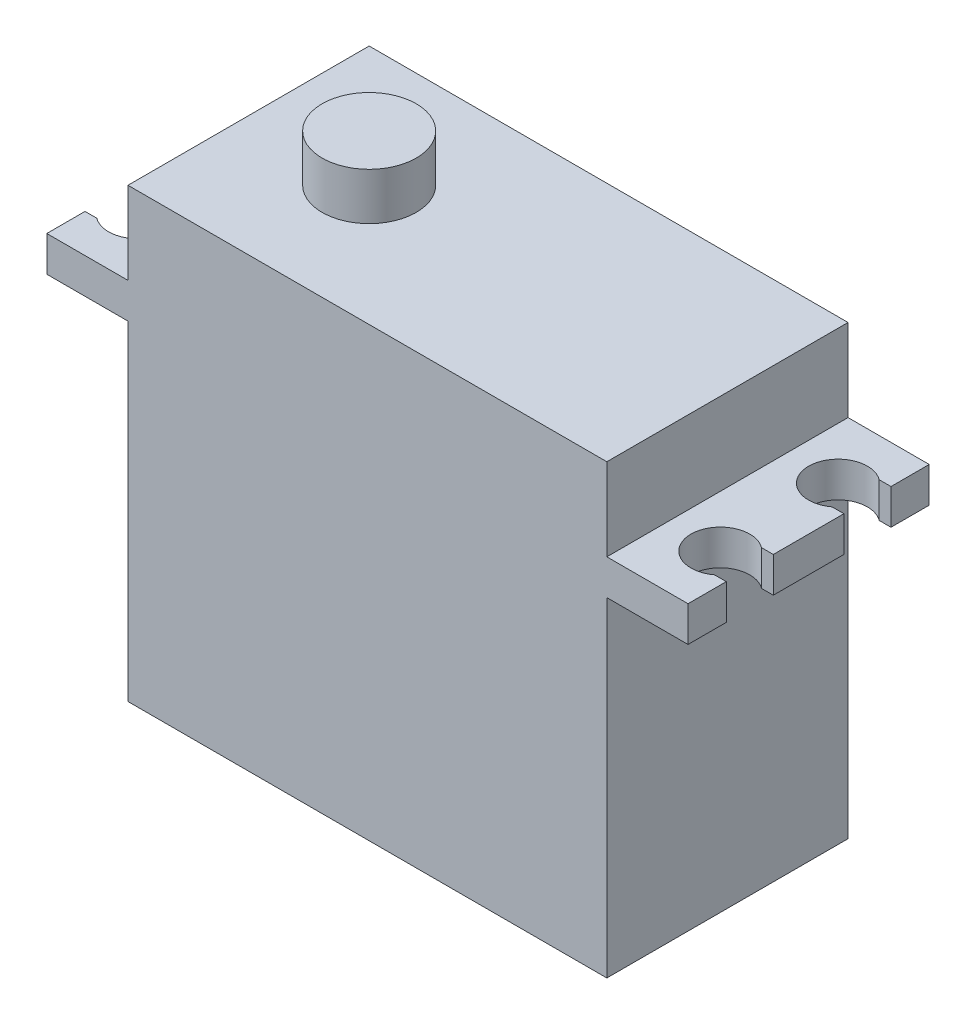
ISO-10303-21;
HEADER;
FILE_DESCRIPTION(('STEP AP214'),'2;1');
FILE_NAME('part.step','',(''),(''),'','','');
FILE_SCHEMA(('AUTOMOTIVE_DESIGN { 1 0 10303 214 1 1 1 1 }'));
ENDSEC;
DATA;
#1=APPLICATION_CONTEXT('core data for automotive mechanical design processes');
#2=APPLICATION_PROTOCOL_DEFINITION('international standard','automotive_design',2000,#1);
#3=PRODUCT_CONTEXT('',#1,'mechanical');
#4=PRODUCT('Part','Part','',(#3));
#5=PRODUCT_RELATED_PRODUCT_CATEGORY('part','',(#4));
#6=PRODUCT_DEFINITION_FORMATION('','',#4);
#7=PRODUCT_DEFINITION_CONTEXT('part definition',#1,'design');
#8=PRODUCT_DEFINITION('design','',#6,#7);
#9=PRODUCT_DEFINITION_SHAPE('','',#8);
#10=(LENGTH_UNIT() NAMED_UNIT(*) SI_UNIT(.MILLI.,.METRE.));
#11=(NAMED_UNIT(*) PLANE_ANGLE_UNIT() SI_UNIT($,.RADIAN.));
#12=(NAMED_UNIT(*) SI_UNIT($,.STERADIAN.) SOLID_ANGLE_UNIT());
#13=UNCERTAINTY_MEASURE_WITH_UNIT(LENGTH_MEASURE(1.E-05),#10,'distance_accuracy_value','');
#14=(GEOMETRIC_REPRESENTATION_CONTEXT(3) GLOBAL_UNCERTAINTY_ASSIGNED_CONTEXT((#13)) GLOBAL_UNIT_ASSIGNED_CONTEXT((#10,
#11,#12)) REPRESENTATION_CONTEXT('',''));
#15=CARTESIAN_POINT('',(0.,0.,0.));
#16=DIRECTION('',(0.,0.,1.));
#17=DIRECTION('',(1.,0.,0.));
#18=AXIS2_PLACEMENT_3D('',#15,#16,#17);
#19=CARTESIAN_POINT('',(47.6,31.,-20.5));
#20=DIRECTION('',(-1.,0.,0.));
#21=DIRECTION('',(0.,0.,1.));
#22=AXIS2_PLACEMENT_3D('',#19,#20,#21);
#23=PLANE('',#22);
#24=DIRECTION('',(0.,0.,-1.));
#25=VECTOR('',#24,1.);
#26=CARTESIAN_POINT('',(47.6,28.,-20.5));
#27=LINE('',#26,#25);
#28=CARTESIAN_POINT('',(47.6,28.,-7.25000000000004));
#29=VERTEX_POINT('',#28);
#30=CARTESIAN_POINT('',(47.6,28.,-13.25));
#31=VERTEX_POINT('',#30);
#32=EDGE_CURVE('E237',#29,#31,#27,.T.);
#33=ORIENTED_EDGE('',*,*,#32,.T.);
#34=DIRECTION('',(0.,-1.,0.));
#35=VECTOR('',#34,1.);
#36=CARTESIAN_POINT('',(47.6,42.,-13.25));
#37=LINE('',#36,#35);
#38=CARTESIAN_POINT('',(47.6,31.,-13.25));
#39=VERTEX_POINT('',#38);
#40=EDGE_CURVE('E221',#39,#31,#37,.T.);
#41=ORIENTED_EDGE('',*,*,#40,.F.);
#42=DIRECTION('',(0.,0.,-1.));
#43=VECTOR('',#42,1.);
#44=CARTESIAN_POINT('',(47.6,31.,-20.5));
#45=LINE('',#44,#43);
#46=CARTESIAN_POINT('',(47.6,31.,-7.25000000000004));
#47=VERTEX_POINT('',#46);
#48=EDGE_CURVE('E369',#47,#39,#45,.T.);
#49=ORIENTED_EDGE('',*,*,#48,.F.);
#50=DIRECTION('',(0.,-1.,0.));
#51=VECTOR('',#50,1.);
#52=CARTESIAN_POINT('',(47.6,42.,-7.25000000000004));
#53=LINE('',#52,#51);
#54=EDGE_CURVE('E244',#47,#29,#53,.T.);
#55=ORIENTED_EDGE('',*,*,#54,.T.);
#56=EDGE_LOOP('',(#33,#41,#49,#55));
#57=FACE_BOUND('',#56,.T.);
#58=ADVANCED_FACE('F36',(#57),#23,.F.);
#59=CARTESIAN_POINT('',(47.6,31.,-17.25));
#60=VERTEX_POINT('',#59);
#61=CARTESIAN_POINT('',(47.6,31.,-20.5));
#62=VERTEX_POINT('',#61);
#63=EDGE_CURVE('E366',#60,#62,#45,.T.);
#64=ORIENTED_EDGE('',*,*,#63,.F.);
#65=DIRECTION('',(0.,-1.,0.));
#66=VECTOR('',#65,1.);
#67=CARTESIAN_POINT('',(47.6,42.,-17.25));
#68=LINE('',#67,#66);
#69=CARTESIAN_POINT('',(47.6,28.,-17.25));
#70=VERTEX_POINT('',#69);
#71=EDGE_CURVE('E230',#60,#70,#68,.T.);
#72=ORIENTED_EDGE('',*,*,#71,.T.);
#73=CARTESIAN_POINT('',(47.6,28.,-20.5));
#74=VERTEX_POINT('',#73);
#75=EDGE_CURVE('E246',#70,#74,#27,.T.);
#76=ORIENTED_EDGE('',*,*,#75,.T.);
#77=DIRECTION('',(0.,-1.,0.));
#78=VECTOR('',#77,1.);
#79=CARTESIAN_POINT('',(47.6,31.,-20.5));
#80=LINE('',#79,#78);
#81=EDGE_CURVE('E261',#62,#74,#80,.T.);
#82=ORIENTED_EDGE('',*,*,#81,.F.);
#83=EDGE_LOOP('',(#64,#72,#76,#82));
#84=FACE_BOUND('',#83,.T.);
#85=ADVANCED_FACE('F461',(#84),#23,.F.);
#86=DIRECTION('',(0.,-1.,0.));
#87=VECTOR('',#86,1.);
#88=CARTESIAN_POINT('',(47.6,42.,-3.25000000000004));
#89=LINE('',#88,#87);
#90=CARTESIAN_POINT('',(47.6,31.,-3.25000000000004));
#91=VERTEX_POINT('',#90);
#92=CARTESIAN_POINT('',(47.6,28.,-3.25000000000004));
#93=VERTEX_POINT('',#92);
#94=EDGE_CURVE('E59',#91,#93,#89,.T.);
#95=ORIENTED_EDGE('',*,*,#94,.F.);
#96=CARTESIAN_POINT('',(47.6,31.,0.));
#97=VERTEX_POINT('',#96);
#98=EDGE_CURVE('E371',#97,#91,#45,.T.);
#99=ORIENTED_EDGE('',*,*,#98,.F.);
#100=DIRECTION('',(0.,-1.,0.));
#101=VECTOR('',#100,1.);
#102=CARTESIAN_POINT('',(47.6,31.,0.));
#103=LINE('',#102,#101);
#104=CARTESIAN_POINT('',(47.6,28.,0.));
#105=VERTEX_POINT('',#104);
#106=EDGE_CURVE('E265',#97,#105,#103,.T.);
#107=ORIENTED_EDGE('',*,*,#106,.T.);
#108=EDGE_CURVE('E245',#105,#93,#27,.T.);
#109=ORIENTED_EDGE('',*,*,#108,.T.);
#110=EDGE_LOOP('',(#95,#99,#107,#109));
#111=FACE_BOUND('',#110,.T.);
#112=ADVANCED_FACE('F463',(#111),#23,.F.);
#113=CARTESIAN_POINT('',(0.,31.,0.));
#114=DIRECTION('',(0.,1.,0.));
#115=DIRECTION('',(0.,0.,1.));
#116=AXIS2_PLACEMENT_3D('',#113,#114,#115);
#117=PLANE('',#116);
#118=DIRECTION('',(1.,0.,0.));
#119=VECTOR('',#118,1.);
#120=CARTESIAN_POINT('',(0.,31.,-13.25));
#121=LINE('',#120,#119);
#122=CARTESIAN_POINT('',(46.6,31.,-13.25));
#123=VERTEX_POINT('',#122);
#124=EDGE_CURVE('E224',#123,#39,#121,.T.);
#125=ORIENTED_EDGE('',*,*,#124,.F.);
#126=CARTESIAN_POINT('',(45.1,31.,-15.25));
#127=DIRECTION('',(0.,1.,0.));
#128=DIRECTION('',(0.,0.,1.));
#129=AXIS2_PLACEMENT_3D('',#126,#127,#128);
#130=CIRCLE('',#129,2.5);
#131=CARTESIAN_POINT('',(46.6,31.,-17.25));
#132=VERTEX_POINT('',#131);
#133=EDGE_CURVE('E229',#132,#123,#130,.T.);
#134=ORIENTED_EDGE('',*,*,#133,.F.);
#135=DIRECTION('',(-1.,0.,0.));
#136=VECTOR('',#135,1.);
#137=CARTESIAN_POINT('',(0.,31.,-17.25));
#138=LINE('',#137,#136);
#139=EDGE_CURVE('E519',#60,#132,#138,.T.);
#140=ORIENTED_EDGE('',*,*,#139,.F.);
#141=ORIENTED_EDGE('',*,*,#63,.T.);
#142=DIRECTION('',(-1.,0.,0.));
#143=VECTOR('',#142,1.);
#144=CARTESIAN_POINT('',(-6.90000000000001,31.,-20.5));
#145=LINE('',#144,#143);
#146=CARTESIAN_POINT('',(40.7,31.,-20.5));
#147=VERTEX_POINT('',#146);
#148=EDGE_CURVE('E262',#62,#147,#145,.T.);
#149=ORIENTED_EDGE('',*,*,#148,.T.);
#150=DIRECTION('',(0.,0.,-1.));
#151=VECTOR('',#150,1.);
#152=CARTESIAN_POINT('',(40.7,31.,0.));
#153=LINE('',#152,#151);
#154=CARTESIAN_POINT('',(40.7,31.,0.));
#155=VERTEX_POINT('',#154);
#156=EDGE_CURVE('E277',#155,#147,#153,.T.);
#157=ORIENTED_EDGE('',*,*,#156,.F.);
#158=DIRECTION('',(1.,0.,0.));
#159=VECTOR('',#158,1.);
#160=CARTESIAN_POINT('',(-6.9,31.,0.));
#161=LINE('',#160,#159);
#162=EDGE_CURVE('E367',#155,#97,#161,.T.);
#163=ORIENTED_EDGE('',*,*,#162,.T.);
#164=ORIENTED_EDGE('',*,*,#98,.T.);
#165=DIRECTION('',(-1.,0.,0.));
#166=VECTOR('',#165,1.);
#167=CARTESIAN_POINT('',(0.,31.,-3.24999999999997));
#168=LINE('',#167,#166);
#169=CARTESIAN_POINT('',(46.6,31.,-3.25000000000003));
#170=VERTEX_POINT('',#169);
#171=EDGE_CURVE('E483',#91,#170,#168,.T.);
#172=ORIENTED_EDGE('',*,*,#171,.T.);
#173=CARTESIAN_POINT('',(45.1,31.,-5.25000000000003));
#174=DIRECTION('',(0.,1.,0.));
#175=DIRECTION('',(0.,0.,1.));
#176=AXIS2_PLACEMENT_3D('',#173,#174,#175);
#177=CIRCLE('',#176,2.5);
#178=CARTESIAN_POINT('',(46.6,31.,-7.25000000000004));
#179=VERTEX_POINT('',#178);
#180=EDGE_CURVE('E443',#170,#179,#177,.F.);
#181=ORIENTED_EDGE('',*,*,#180,.T.);
#182=DIRECTION('',(1.,0.,0.));
#183=VECTOR('',#182,1.);
#184=CARTESIAN_POINT('',(0.,31.,-7.24999999999997));
#185=LINE('',#184,#183);
#186=EDGE_CURVE('E439',#179,#47,#185,.T.);
#187=ORIENTED_EDGE('',*,*,#186,.T.);
#188=ORIENTED_EDGE('',*,*,#48,.T.);
#189=EDGE_LOOP('',(#125,#134,#140,#141,#149,#157,#163,#164,#172,#181,#187,#188));
#190=FACE_BOUND('',#189,.T.);
#191=ADVANCED_FACE('F471',(#190),#117,.T.);
#192=CARTESIAN_POINT('',(0.,28.,0.));
#193=DIRECTION('',(0.,1.,0.));
#194=DIRECTION('',(0.,0.,1.));
#195=AXIS2_PLACEMENT_3D('',#192,#193,#194);
#196=PLANE('',#195);
#197=CARTESIAN_POINT('',(45.1,28.,-15.25));
#198=DIRECTION('',(0.,-1.,0.));
#199=DIRECTION('',(0.,0.,1.));
#200=AXIS2_PLACEMENT_3D('',#197,#198,#199);
#201=CIRCLE('',#200,2.5);
#202=CARTESIAN_POINT('',(46.6,28.,-13.25));
#203=VERTEX_POINT('',#202);
#204=CARTESIAN_POINT('',(46.6,28.,-17.25));
#205=VERTEX_POINT('',#204);
#206=EDGE_CURVE('E240',#203,#205,#201,.T.);
#207=ORIENTED_EDGE('',*,*,#206,.F.);
#208=DIRECTION('',(-1.,0.,0.));
#209=VECTOR('',#208,1.);
#210=CARTESIAN_POINT('',(47.6,28.,-13.25));
#211=LINE('',#210,#209);
#212=EDGE_CURVE('E51',#31,#203,#211,.T.);
#213=ORIENTED_EDGE('',*,*,#212,.F.);
#214=ORIENTED_EDGE('',*,*,#32,.F.);
#215=DIRECTION('',(-1.,0.,0.));
#216=VECTOR('',#215,1.);
#217=CARTESIAN_POINT('',(47.6,28.,-7.25000000000004));
#218=LINE('',#217,#216);
#219=CARTESIAN_POINT('',(46.6,28.,-7.25000000000004));
#220=VERTEX_POINT('',#219);
#221=EDGE_CURVE('E493',#29,#220,#218,.T.);
#222=ORIENTED_EDGE('',*,*,#221,.T.);
#223=CARTESIAN_POINT('',(45.1,28.,-5.25000000000003));
#224=DIRECTION('',(0.,1.,0.));
#225=DIRECTION('',(0.,0.,-1.));
#226=AXIS2_PLACEMENT_3D('',#223,#224,#225);
#227=CIRCLE('',#226,2.5);
#228=CARTESIAN_POINT('',(46.6,28.,-3.25000000000003));
#229=VERTEX_POINT('',#228);
#230=EDGE_CURVE('E489',#220,#229,#227,.T.);
#231=ORIENTED_EDGE('',*,*,#230,.T.);
#232=DIRECTION('',(1.,0.,0.));
#233=VECTOR('',#232,1.);
#234=CARTESIAN_POINT('',(46.6,28.,-3.25000000000003));
#235=LINE('',#234,#233);
#236=EDGE_CURVE('E487',#229,#93,#235,.T.);
#237=ORIENTED_EDGE('',*,*,#236,.T.);
#238=ORIENTED_EDGE('',*,*,#108,.F.);
#239=DIRECTION('',(1.,0.,0.));
#240=VECTOR('',#239,1.);
#241=CARTESIAN_POINT('',(-6.9,28.,0.));
#242=LINE('',#241,#240);
#243=CARTESIAN_POINT('',(40.7,28.,0.));
#244=VERTEX_POINT('',#243);
#245=EDGE_CURVE('E350',#244,#105,#242,.T.);
#246=ORIENTED_EDGE('',*,*,#245,.F.);
#247=DIRECTION('',(0.,0.,-1.));
#248=VECTOR('',#247,1.);
#249=CARTESIAN_POINT('',(40.7,28.,0.));
#250=LINE('',#249,#248);
#251=CARTESIAN_POINT('',(40.7,28.,-20.5));
#252=VERTEX_POINT('',#251);
#253=EDGE_CURVE('E271',#244,#252,#250,.T.);
#254=ORIENTED_EDGE('',*,*,#253,.T.);
#255=DIRECTION('',(-1.,0.,0.));
#256=VECTOR('',#255,1.);
#257=CARTESIAN_POINT('',(-6.90000000000001,28.,-20.5));
#258=LINE('',#257,#256);
#259=EDGE_CURVE('E254',#74,#252,#258,.T.);
#260=ORIENTED_EDGE('',*,*,#259,.F.);
#261=ORIENTED_EDGE('',*,*,#75,.F.);
#262=DIRECTION('',(1.,0.,0.));
#263=VECTOR('',#262,1.);
#264=CARTESIAN_POINT('',(46.6,28.,-17.25));
#265=LINE('',#264,#263);
#266=EDGE_CURVE('E241',#205,#70,#265,.T.);
#267=ORIENTED_EDGE('',*,*,#266,.F.);
#268=EDGE_LOOP('',(#207,#213,#214,#222,#231,#237,#238,#246,#254,#260,#261,#267));
#269=FACE_BOUND('',#268,.T.);
#270=ADVANCED_FACE('F235',(#269),#196,.F.);
#271=CARTESIAN_POINT('',(-6.90000000000001,31.,-20.5));
#272=DIRECTION('',(1.,0.,0.));
#273=DIRECTION('',(0.,0.,-1.));
#274=AXIS2_PLACEMENT_3D('',#271,#272,#273);
#275=PLANE('',#274);
#276=DIRECTION('',(0.,0.,1.));
#277=VECTOR('',#276,1.);
#278=CARTESIAN_POINT('',(-6.90000000000001,28.,-20.5));
#279=LINE('',#278,#277);
#280=CARTESIAN_POINT('',(-6.90000000000001,28.,-13.25));
#281=VERTEX_POINT('',#280);
#282=CARTESIAN_POINT('',(-6.90000000000001,28.,-7.25));
#283=VERTEX_POINT('',#282);
#284=EDGE_CURVE('E341',#281,#283,#279,.T.);
#285=ORIENTED_EDGE('',*,*,#284,.T.);
#286=DIRECTION('',(0.,1.,0.));
#287=VECTOR('',#286,1.);
#288=CARTESIAN_POINT('',(-6.90000000000001,31.,-7.25));
#289=LINE('',#288,#287);
#290=CARTESIAN_POINT('',(-6.90000000000001,31.,-7.25));
#291=VERTEX_POINT('',#290);
#292=EDGE_CURVE('E12',#283,#291,#289,.T.);
#293=ORIENTED_EDGE('',*,*,#292,.T.);
#294=DIRECTION('',(0.,0.,1.));
#295=VECTOR('',#294,1.);
#296=CARTESIAN_POINT('',(-6.90000000000001,31.,-20.5));
#297=LINE('',#296,#295);
#298=CARTESIAN_POINT('',(-6.90000000000001,31.,-13.25));
#299=VERTEX_POINT('',#298);
#300=EDGE_CURVE('E393',#299,#291,#297,.T.);
#301=ORIENTED_EDGE('',*,*,#300,.F.);
#302=DIRECTION('',(0.,1.,0.));
#303=VECTOR('',#302,1.);
#304=CARTESIAN_POINT('',(-6.90000000000001,31.,-13.25));
#305=LINE('',#304,#303);
#306=EDGE_CURVE('E324',#281,#299,#305,.T.);
#307=ORIENTED_EDGE('',*,*,#306,.F.);
#308=EDGE_LOOP('',(#285,#293,#301,#307));
#309=FACE_BOUND('',#308,.T.);
#310=ADVANCED_FACE('F429',(#309),#275,.F.);
#311=DIRECTION('',(-1.,0.,0.));
#312=VECTOR('',#311,1.);
#313=CARTESIAN_POINT('',(0.,31.,-7.25));
#314=LINE('',#313,#312);
#315=CARTESIAN_POINT('',(-5.90000000000002,31.,-7.25));
#316=VERTEX_POINT('',#315);
#317=EDGE_CURVE('E399',#316,#291,#314,.T.);
#318=ORIENTED_EDGE('',*,*,#317,.F.);
#319=CARTESIAN_POINT('',(-4.40000000000001,31.,-5.25));
#320=DIRECTION('',(0.,1.,0.));
#321=DIRECTION('',(0.,0.,1.));
#322=AXIS2_PLACEMENT_3D('',#319,#320,#321);
#323=CIRCLE('',#322,2.5);
#324=CARTESIAN_POINT('',(-5.90000000000001,31.,-3.25));
#325=VERTEX_POINT('',#324);
#326=EDGE_CURVE('E397',#325,#316,#323,.T.);
#327=ORIENTED_EDGE('',*,*,#326,.F.);
#328=DIRECTION('',(1.,0.,0.));
#329=VECTOR('',#328,1.);
#330=CARTESIAN_POINT('',(0.,31.,-3.25));
#331=LINE('',#330,#329);
#332=CARTESIAN_POINT('',(-6.90000000000001,31.,-3.25));
#333=VERTEX_POINT('',#332);
#334=EDGE_CURVE('E396',#333,#325,#331,.T.);
#335=ORIENTED_EDGE('',*,*,#334,.F.);
#336=CARTESIAN_POINT('',(-6.9,31.,0.));
#337=VERTEX_POINT('',#336);
#338=EDGE_CURVE('E257',#333,#337,#297,.T.);
#339=ORIENTED_EDGE('',*,*,#338,.T.);
#340=CARTESIAN_POINT('',(0.,31.,0.));
#341=VERTEX_POINT('',#340);
#342=EDGE_CURVE('E362',#337,#341,#161,.T.);
#343=ORIENTED_EDGE('',*,*,#342,.T.);
#344=DIRECTION('',(0.,0.,1.));
#345=VECTOR('',#344,1.);
#346=CARTESIAN_POINT('',(0.,31.,0.));
#347=LINE('',#346,#345);
#348=CARTESIAN_POINT('',(0.,31.,-20.5));
#349=VERTEX_POINT('',#348);
#350=EDGE_CURVE('E279',#349,#341,#347,.T.);
#351=ORIENTED_EDGE('',*,*,#350,.F.);
#352=CARTESIAN_POINT('',(-6.90000000000001,31.,-20.5));
#353=VERTEX_POINT('',#352);
#354=EDGE_CURVE('E375',#349,#353,#145,.T.);
#355=ORIENTED_EDGE('',*,*,#354,.T.);
#356=CARTESIAN_POINT('',(-6.90000000000001,31.,-17.25));
#357=VERTEX_POINT('',#356);
#358=EDGE_CURVE('E372',#353,#357,#297,.T.);
#359=ORIENTED_EDGE('',*,*,#358,.T.);
#360=DIRECTION('',(1.,0.,0.));
#361=VECTOR('',#360,1.);
#362=CARTESIAN_POINT('',(0.,31.,-17.25));
#363=LINE('',#362,#361);
#364=CARTESIAN_POINT('',(-5.90000000000001,31.,-17.25));
#365=VERTEX_POINT('',#364);
#366=EDGE_CURVE('E421',#357,#365,#363,.T.);
#367=ORIENTED_EDGE('',*,*,#366,.T.);
#368=CARTESIAN_POINT('',(-4.40000000000001,31.,-15.25));
#369=DIRECTION('',(0.,1.,0.));
#370=DIRECTION('',(0.,0.,1.));
#371=AXIS2_PLACEMENT_3D('',#368,#369,#370);
#372=CIRCLE('',#371,2.5);
#373=CARTESIAN_POINT('',(-5.90000000000002,31.,-13.25));
#374=VERTEX_POINT('',#373);
#375=EDGE_CURVE('E342',#365,#374,#372,.F.);
#376=ORIENTED_EDGE('',*,*,#375,.T.);
#377=DIRECTION('',(-1.,0.,0.));
#378=VECTOR('',#377,1.);
#379=CARTESIAN_POINT('',(0.,31.,-13.25));
#380=LINE('',#379,#378);
#381=EDGE_CURVE('E346',#374,#299,#380,.T.);
#382=ORIENTED_EDGE('',*,*,#381,.T.);
#383=ORIENTED_EDGE('',*,*,#300,.T.);
#384=EDGE_LOOP('',(#318,#327,#335,#339,#343,#351,#355,#359,#367,#376,#382,#383));
#385=FACE_BOUND('',#384,.T.);
#386=ADVANCED_FACE('F384',(#385),#117,.T.);
#387=CARTESIAN_POINT('',(-4.40000000000001,28.,-5.25));
#388=DIRECTION('',(0.,-1.,0.));
#389=DIRECTION('',(0.,0.,-1.));
#390=AXIS2_PLACEMENT_3D('',#387,#388,#389);
#391=CIRCLE('',#390,2.5);
#392=CARTESIAN_POINT('',(-5.90000000000002,28.,-7.25));
#393=VERTEX_POINT('',#392);
#394=CARTESIAN_POINT('',(-5.90000000000001,28.,-3.25));
#395=VERTEX_POINT('',#394);
#396=EDGE_CURVE('E438',#393,#395,#391,.T.);
#397=ORIENTED_EDGE('',*,*,#396,.F.);
#398=DIRECTION('',(1.,0.,0.));
#399=VECTOR('',#398,1.);
#400=CARTESIAN_POINT('',(-6.90000000000001,28.,-7.25));
#401=LINE('',#400,#399);
#402=EDGE_CURVE('E436',#283,#393,#401,.T.);
#403=ORIENTED_EDGE('',*,*,#402,.F.);
#404=ORIENTED_EDGE('',*,*,#284,.F.);
#405=DIRECTION('',(1.,0.,0.));
#406=VECTOR('',#405,1.);
#407=CARTESIAN_POINT('',(-6.90000000000001,28.,-13.25));
#408=LINE('',#407,#406);
#409=CARTESIAN_POINT('',(-5.90000000000002,28.,-13.25));
#410=VERTEX_POINT('',#409);
#411=EDGE_CURVE('E408',#281,#410,#408,.T.);
#412=ORIENTED_EDGE('',*,*,#411,.T.);
#413=CARTESIAN_POINT('',(-4.40000000000001,28.,-15.25));
#414=DIRECTION('',(0.,1.,0.));
#415=DIRECTION('',(0.,0.,1.));
#416=AXIS2_PLACEMENT_3D('',#413,#414,#415);
#417=CIRCLE('',#416,2.5);
#418=CARTESIAN_POINT('',(-5.90000000000001,28.,-17.25));
#419=VERTEX_POINT('',#418);
#420=EDGE_CURVE('E411',#410,#419,#417,.T.);
#421=ORIENTED_EDGE('',*,*,#420,.T.);
#422=DIRECTION('',(-1.,0.,0.));
#423=VECTOR('',#422,1.);
#424=CARTESIAN_POINT('',(-5.90000000000001,28.,-17.25));
#425=LINE('',#424,#423);
#426=CARTESIAN_POINT('',(-6.90000000000001,28.,-17.25));
#427=VERTEX_POINT('',#426);
#428=EDGE_CURVE('E414',#419,#427,#425,.T.);
#429=ORIENTED_EDGE('',*,*,#428,.T.);
#430=CARTESIAN_POINT('',(-6.90000000000001,28.,-20.5));
#431=VERTEX_POINT('',#430);
#432=EDGE_CURVE('E343',#431,#427,#279,.T.);
#433=ORIENTED_EDGE('',*,*,#432,.F.);
#434=CARTESIAN_POINT('',(0.,28.,-20.5));
#435=VERTEX_POINT('',#434);
#436=EDGE_CURVE('E249',#435,#431,#258,.T.);
#437=ORIENTED_EDGE('',*,*,#436,.F.);
#438=DIRECTION('',(0.,0.,1.));
#439=VECTOR('',#438,1.);
#440=CARTESIAN_POINT('',(0.,28.,0.));
#441=LINE('',#440,#439);
#442=CARTESIAN_POINT('',(0.,28.,0.));
#443=VERTEX_POINT('',#442);
#444=EDGE_CURVE('E274',#435,#443,#441,.T.);
#445=ORIENTED_EDGE('',*,*,#444,.T.);
#446=CARTESIAN_POINT('',(-6.9,28.,0.));
#447=VERTEX_POINT('',#446);
#448=EDGE_CURVE('E250',#447,#443,#242,.T.);
#449=ORIENTED_EDGE('',*,*,#448,.F.);
#450=CARTESIAN_POINT('',(-6.90000000000001,28.,-3.25));
#451=VERTEX_POINT('',#450);
#452=EDGE_CURVE('E331',#451,#447,#279,.T.);
#453=ORIENTED_EDGE('',*,*,#452,.F.);
#454=DIRECTION('',(-1.,0.,0.));
#455=VECTOR('',#454,1.);
#456=CARTESIAN_POINT('',(-5.90000000000001,28.,-3.25));
#457=LINE('',#456,#455);
#458=EDGE_CURVE('E339',#395,#451,#457,.T.);
#459=ORIENTED_EDGE('',*,*,#458,.F.);
#460=EDGE_LOOP('',(#397,#403,#404,#412,#421,#429,#433,#437,#445,#449,#453,#459));
#461=FACE_BOUND('',#460,.T.);
#462=ADVANCED_FACE('F338',(#461),#196,.F.);
#463=ORIENTED_EDGE('',*,*,#338,.F.);
#464=DIRECTION('',(0.,-1.,0.));
#465=VECTOR('',#464,1.);
#466=CARTESIAN_POINT('',(-6.90000000000001,31.,-3.25));
#467=LINE('',#466,#465);
#468=EDGE_CURVE('E44',#333,#451,#467,.T.);
#469=ORIENTED_EDGE('',*,*,#468,.T.);
#470=ORIENTED_EDGE('',*,*,#452,.T.);
#471=DIRECTION('',(0.,-1.,0.));
#472=VECTOR('',#471,1.);
#473=CARTESIAN_POINT('',(-6.9,31.,0.));
#474=LINE('',#473,#472);
#475=EDGE_CURVE('E268',#337,#447,#474,.T.);
#476=ORIENTED_EDGE('',*,*,#475,.F.);
#477=EDGE_LOOP('',(#463,#469,#470,#476));
#478=FACE_BOUND('',#477,.T.);
#479=ADVANCED_FACE('F329',(#478),#275,.F.);
#480=DIRECTION('',(0.,-1.,0.));
#481=VECTOR('',#480,1.);
#482=CARTESIAN_POINT('',(-6.90000000000001,31.,-17.25));
#483=LINE('',#482,#481);
#484=EDGE_CURVE('E322',#357,#427,#483,.T.);
#485=ORIENTED_EDGE('',*,*,#484,.F.);
#486=ORIENTED_EDGE('',*,*,#358,.F.);
#487=DIRECTION('',(0.,-1.,0.));
#488=VECTOR('',#487,1.);
#489=CARTESIAN_POINT('',(-6.90000000000001,31.,-20.5));
#490=LINE('',#489,#488);
#491=EDGE_CURVE('E258',#353,#431,#490,.T.);
#492=ORIENTED_EDGE('',*,*,#491,.T.);
#493=ORIENTED_EDGE('',*,*,#432,.T.);
#494=EDGE_LOOP('',(#485,#486,#492,#493));
#495=FACE_BOUND('',#494,.T.);
#496=ADVANCED_FACE('F392',(#495),#275,.F.);
#497=CARTESIAN_POINT('',(0.,38.,0.));
#498=DIRECTION('',(1.,0.,0.));
#499=DIRECTION('',(0.,0.,-1.));
#500=AXIS2_PLACEMENT_3D('',#497,#498,#499);
#501=PLANE('',#500);
#502=ORIENTED_EDGE('',*,*,#444,.F.);
#503=DIRECTION('',(0.,-1.,0.));
#504=VECTOR('',#503,1.);
#505=CARTESIAN_POINT('',(0.,38.,-20.5));
#506=LINE('',#505,#504);
#507=CARTESIAN_POINT('',(0.,0.,-20.5));
#508=VERTEX_POINT('',#507);
#509=EDGE_CURVE('E295',#435,#508,#506,.T.);
#510=ORIENTED_EDGE('',*,*,#509,.T.);
#511=DIRECTION('',(0.,0.,1.));
#512=VECTOR('',#511,1.);
#513=CARTESIAN_POINT('',(0.,0.,0.));
#514=LINE('',#513,#512);
#515=CARTESIAN_POINT('',(0.,0.,0.));
#516=VERTEX_POINT('',#515);
#517=EDGE_CURVE('E284',#508,#516,#514,.T.);
#518=ORIENTED_EDGE('',*,*,#517,.T.);
#519=DIRECTION('',(0.,-1.,0.));
#520=VECTOR('',#519,1.);
#521=CARTESIAN_POINT('',(0.,38.,0.));
#522=LINE('',#521,#520);
#523=EDGE_CURVE('E315',#443,#516,#522,.T.);
#524=ORIENTED_EDGE('',*,*,#523,.F.);
#525=EDGE_LOOP('',(#502,#510,#518,#524));
#526=FACE_BOUND('',#525,.T.);
#527=ADVANCED_FACE('F549',(#526),#501,.F.);
#528=CARTESIAN_POINT('',(40.7,38.,0.));
#529=DIRECTION('',(-1.,0.,0.));
#530=DIRECTION('',(0.,0.,1.));
#531=AXIS2_PLACEMENT_3D('',#528,#529,#530);
#532=PLANE('',#531);
#533=ORIENTED_EDGE('',*,*,#253,.F.);
#534=DIRECTION('',(0.,-1.,0.));
#535=VECTOR('',#534,1.);
#536=CARTESIAN_POINT('',(40.7,38.,0.));
#537=LINE('',#536,#535);
#538=CARTESIAN_POINT('',(40.7,0.,0.));
#539=VERTEX_POINT('',#538);
#540=EDGE_CURVE('E312',#244,#539,#537,.T.);
#541=ORIENTED_EDGE('',*,*,#540,.T.);
#542=DIRECTION('',(0.,0.,-1.));
#543=VECTOR('',#542,1.);
#544=CARTESIAN_POINT('',(40.7,0.,0.));
#545=LINE('',#544,#543);
#546=CARTESIAN_POINT('',(40.7,0.,-20.5));
#547=VERTEX_POINT('',#546);
#548=EDGE_CURVE('E301',#539,#547,#545,.T.);
#549=ORIENTED_EDGE('',*,*,#548,.T.);
#550=DIRECTION('',(0.,-1.,0.));
#551=VECTOR('',#550,1.);
#552=CARTESIAN_POINT('',(40.7,38.,-20.5));
#553=LINE('',#552,#551);
#554=EDGE_CURVE('E308',#252,#547,#553,.T.);
#555=ORIENTED_EDGE('',*,*,#554,.F.);
#556=EDGE_LOOP('',(#533,#541,#549,#555));
#557=FACE_BOUND('',#556,.T.);
#558=ADVANCED_FACE('F548',(#557),#532,.F.);
#559=CARTESIAN_POINT('',(0.,38.,-20.5));
#560=VERTEX_POINT('',#559);
#561=EDGE_CURVE('E306',#560,#349,#506,.T.);
#562=ORIENTED_EDGE('',*,*,#561,.T.);
#563=ORIENTED_EDGE('',*,*,#350,.T.);
#564=CARTESIAN_POINT('',(0.,38.,0.));
#565=VERTEX_POINT('',#564);
#566=EDGE_CURVE('E316',#565,#341,#522,.T.);
#567=ORIENTED_EDGE('',*,*,#566,.F.);
#568=DIRECTION('',(0.,0.,1.));
#569=VECTOR('',#568,1.);
#570=CARTESIAN_POINT('',(0.,38.,0.));
#571=LINE('',#570,#569);
#572=EDGE_CURVE('E285',#560,#565,#571,.T.);
#573=ORIENTED_EDGE('',*,*,#572,.F.);
#574=EDGE_LOOP('',(#562,#563,#567,#573));
#575=FACE_BOUND('',#574,.T.);
#576=ADVANCED_FACE('F38',(#575),#501,.F.);
#577=CARTESIAN_POINT('',(0.,38.,0.));
#578=DIRECTION('',(0.,0.,-1.));
#579=DIRECTION('',(-1.,0.,0.));
#580=AXIS2_PLACEMENT_3D('',#577,#578,#579);
#581=PLANE('',#580);
#582=ORIENTED_EDGE('',*,*,#566,.T.);
#583=ORIENTED_EDGE('',*,*,#342,.F.);
#584=ORIENTED_EDGE('',*,*,#475,.T.);
#585=ORIENTED_EDGE('',*,*,#448,.T.);
#586=ORIENTED_EDGE('',*,*,#523,.T.);
#587=DIRECTION('',(1.,0.,0.));
#588=VECTOR('',#587,1.);
#589=CARTESIAN_POINT('',(0.,0.,0.));
#590=LINE('',#589,#588);
#591=EDGE_CURVE('E298',#516,#539,#590,.T.);
#592=ORIENTED_EDGE('',*,*,#591,.T.);
#593=ORIENTED_EDGE('',*,*,#540,.F.);
#594=ORIENTED_EDGE('',*,*,#245,.T.);
#595=ORIENTED_EDGE('',*,*,#106,.F.);
#596=ORIENTED_EDGE('',*,*,#162,.F.);
#597=CARTESIAN_POINT('',(40.7,38.,0.));
#598=VERTEX_POINT('',#597);
#599=EDGE_CURVE('E313',#598,#155,#537,.T.);
#600=ORIENTED_EDGE('',*,*,#599,.F.);
#601=DIRECTION('',(1.,0.,0.));
#602=VECTOR('',#601,1.);
#603=CARTESIAN_POINT('',(0.,38.,0.));
#604=LINE('',#603,#602);
#605=EDGE_CURVE('E288',#565,#598,#604,.T.);
#606=ORIENTED_EDGE('',*,*,#605,.F.);
#607=EDGE_LOOP('',(#582,#583,#584,#585,#586,#592,#593,#594,#595,#596,#600,#606));
#608=FACE_BOUND('',#607,.T.);
#609=ADVANCED_FACE('F358',(#608),#581,.F.);
#610=ORIENTED_EDGE('',*,*,#599,.T.);
#611=ORIENTED_EDGE('',*,*,#156,.T.);
#612=CARTESIAN_POINT('',(40.7,38.,-20.5));
#613=VERTEX_POINT('',#612);
#614=EDGE_CURVE('E309',#613,#147,#553,.T.);
#615=ORIENTED_EDGE('',*,*,#614,.F.);
#616=DIRECTION('',(0.,0.,-1.));
#617=VECTOR('',#616,1.);
#618=CARTESIAN_POINT('',(40.7,38.,0.));
#619=LINE('',#618,#617);
#620=EDGE_CURVE('E291',#598,#613,#619,.T.);
#621=ORIENTED_EDGE('',*,*,#620,.F.);
#622=EDGE_LOOP('',(#610,#611,#615,#621));
#623=FACE_BOUND('',#622,.T.);
#624=ADVANCED_FACE('F542',(#623),#532,.F.);
#625=CARTESIAN_POINT('',(0.,38.,-20.5));
#626=DIRECTION('',(0.,0.,1.));
#627=DIRECTION('',(1.,0.,0.));
#628=AXIS2_PLACEMENT_3D('',#625,#626,#627);
#629=PLANE('',#628);
#630=ORIENTED_EDGE('',*,*,#614,.T.);
#631=ORIENTED_EDGE('',*,*,#148,.F.);
#632=ORIENTED_EDGE('',*,*,#81,.T.);
#633=ORIENTED_EDGE('',*,*,#259,.T.);
#634=ORIENTED_EDGE('',*,*,#554,.T.);
#635=DIRECTION('',(-1.,0.,0.));
#636=VECTOR('',#635,1.);
#637=CARTESIAN_POINT('',(0.,0.,-20.5));
#638=LINE('',#637,#636);
#639=EDGE_CURVE('E289',#547,#508,#638,.T.);
#640=ORIENTED_EDGE('',*,*,#639,.T.);
#641=ORIENTED_EDGE('',*,*,#509,.F.);
#642=ORIENTED_EDGE('',*,*,#436,.T.);
#643=ORIENTED_EDGE('',*,*,#491,.F.);
#644=ORIENTED_EDGE('',*,*,#354,.F.);
#645=ORIENTED_EDGE('',*,*,#561,.F.);
#646=DIRECTION('',(-1.,0.,0.));
#647=VECTOR('',#646,1.);
#648=CARTESIAN_POINT('',(0.,38.,-20.5));
#649=LINE('',#648,#647);
#650=EDGE_CURVE('E293',#613,#560,#649,.T.);
#651=ORIENTED_EDGE('',*,*,#650,.F.);
#652=EDGE_LOOP('',(#630,#631,#632,#633,#634,#640,#641,#642,#643,#644,#645,#651));
#653=FACE_BOUND('',#652,.T.);
#654=ADVANCED_FACE('F389',(#653),#629,.F.);
#655=CARTESIAN_POINT('',(0.,38.,0.));
#656=DIRECTION('',(0.,-1.,0.));
#657=DIRECTION('',(0.,0.,-1.));
#658=AXIS2_PLACEMENT_3D('',#655,#656,#657);
#659=PLANE('',#658);
#660=CARTESIAN_POINT('',(10.25,38.,-10.25));
#661=DIRECTION('',(0.,-1.,0.));
#662=DIRECTION('',(0.,0.,-1.));
#663=AXIS2_PLACEMENT_3D('',#660,#661,#662);
#664=CIRCLE('',#663,4.);
#665=CARTESIAN_POINT('',(10.25,38.,-14.25));
#666=VERTEX_POINT('',#665);
#667=EDGE_CURVE('E319',#666,#666,#664,.F.);
#668=ORIENTED_EDGE('',*,*,#667,.F.);
#669=EDGE_LOOP('',(#668));
#670=FACE_BOUND('',#669,.T.);
#671=ORIENTED_EDGE('',*,*,#572,.T.);
#672=ORIENTED_EDGE('',*,*,#605,.T.);
#673=ORIENTED_EDGE('',*,*,#620,.T.);
#674=ORIENTED_EDGE('',*,*,#650,.T.);
#675=EDGE_LOOP('',(#671,#672,#673,#674));
#676=FACE_BOUND('',#675,.T.);
#677=ADVANCED_FACE('F545',(#670,#676),#659,.F.);
#678=CARTESIAN_POINT('',(0.,0.,0.));
#679=DIRECTION('',(0.,-1.,0.));
#680=DIRECTION('',(0.,0.,-1.));
#681=AXIS2_PLACEMENT_3D('',#678,#679,#680);
#682=PLANE('',#681);
#683=ORIENTED_EDGE('',*,*,#517,.F.);
#684=ORIENTED_EDGE('',*,*,#639,.F.);
#685=ORIENTED_EDGE('',*,*,#548,.F.);
#686=ORIENTED_EDGE('',*,*,#591,.F.);
#687=EDGE_LOOP('',(#683,#684,#685,#686));
#688=FACE_BOUND('',#687,.T.);
#689=ADVANCED_FACE('F596',(#688),#682,.T.);
#690=CARTESIAN_POINT('',(10.25,95.3137084989848,-10.25));
#691=DIRECTION('',(0.,-1.,0.));
#692=DIRECTION('',(0.,0.,-1.));
#693=AXIS2_PLACEMENT_3D('',#690,#691,#692);
#694=CYLINDRICAL_SURFACE('',#693,4.);
#695=CARTESIAN_POINT('',(10.25,42.,-10.25));
#696=DIRECTION('',(0.,-1.,0.));
#697=DIRECTION('',(0.,0.,-1.));
#698=AXIS2_PLACEMENT_3D('',#695,#696,#697);
#699=CIRCLE('',#698,4.);
#700=CARTESIAN_POINT('',(10.25,42.,-14.25));
#701=VERTEX_POINT('',#700);
#702=EDGE_CURVE('E281',#701,#701,#699,.T.);
#703=CARTESIAN_POINT('',(10.25,42.,-14.25));
#704=CARTESIAN_POINT('',(10.25,41.9583333333333,-14.25));
#705=CARTESIAN_POINT('',(10.25,41.9166666666667,-14.25));
#706=CARTESIAN_POINT('',(10.25,41.8333333333333,-14.25));
#707=CARTESIAN_POINT('',(10.25,41.7916666666667,-14.25));
#708=CARTESIAN_POINT('',(10.25,41.7083333333333,-14.25));
#709=CARTESIAN_POINT('',(10.25,41.6666666666667,-14.25));
#710=CARTESIAN_POINT('',(10.25,41.5833333333333,-14.25));
#711=CARTESIAN_POINT('',(10.25,41.5416666666667,-14.25));
#712=CARTESIAN_POINT('',(10.25,41.4583333333333,-14.25));
#713=CARTESIAN_POINT('',(10.25,41.4166666666667,-14.25));
#714=CARTESIAN_POINT('',(10.25,41.3333333333333,-14.25));
#715=CARTESIAN_POINT('',(10.25,41.2916666666667,-14.25));
#716=CARTESIAN_POINT('',(10.25,41.2083333333333,-14.25));
#717=CARTESIAN_POINT('',(10.25,41.1666666666667,-14.25));
#718=CARTESIAN_POINT('',(10.25,41.0833333333333,-14.25));
#719=CARTESIAN_POINT('',(10.25,41.0416666666667,-14.25));
#720=CARTESIAN_POINT('',(10.25,40.9583333333333,-14.25));
#721=CARTESIAN_POINT('',(10.25,40.9166666666667,-14.25));
#722=CARTESIAN_POINT('',(10.25,40.8333333333333,-14.25));
#723=CARTESIAN_POINT('',(10.25,40.7916666666667,-14.25));
#724=CARTESIAN_POINT('',(10.25,40.7083333333333,-14.25));
#725=CARTESIAN_POINT('',(10.25,40.6666666666667,-14.25));
#726=CARTESIAN_POINT('',(10.25,40.5833333333333,-14.25));
#727=CARTESIAN_POINT('',(10.25,40.5416666666667,-14.25));
#728=CARTESIAN_POINT('',(10.25,40.4583333333333,-14.25));
#729=CARTESIAN_POINT('',(10.25,40.4166666666667,-14.25));
#730=CARTESIAN_POINT('',(10.25,40.3333333333333,-14.25));
#731=CARTESIAN_POINT('',(10.25,40.2916666666667,-14.25));
#732=CARTESIAN_POINT('',(10.25,40.2083333333333,-14.25));
#733=CARTESIAN_POINT('',(10.25,40.1666666666667,-14.25));
#734=CARTESIAN_POINT('',(10.25,40.0833333333333,-14.25));
#735=CARTESIAN_POINT('',(10.25,40.0416666666667,-14.25));
#736=CARTESIAN_POINT('',(10.25,39.9583333333333,-14.25));
#737=CARTESIAN_POINT('',(10.25,39.9166666666667,-14.25));
#738=CARTESIAN_POINT('',(10.25,39.8333333333333,-14.25));
#739=CARTESIAN_POINT('',(10.25,39.7916666666667,-14.25));
#740=CARTESIAN_POINT('',(10.25,39.7083333333333,-14.25));
#741=CARTESIAN_POINT('',(10.25,39.6666666666667,-14.25));
#742=CARTESIAN_POINT('',(10.25,39.5833333333333,-14.25));
#743=CARTESIAN_POINT('',(10.25,39.5416666666667,-14.25));
#744=CARTESIAN_POINT('',(10.25,39.4583333333333,-14.25));
#745=CARTESIAN_POINT('',(10.25,39.4166666666667,-14.25));
#746=CARTESIAN_POINT('',(10.25,39.3333333333333,-14.25));
#747=CARTESIAN_POINT('',(10.25,39.2916666666667,-14.25));
#748=CARTESIAN_POINT('',(10.25,39.2083333333333,-14.25));
#749=CARTESIAN_POINT('',(10.25,39.1666666666667,-14.25));
#750=CARTESIAN_POINT('',(10.25,39.0833333333333,-14.25));
#751=CARTESIAN_POINT('',(10.25,39.0416666666667,-14.25));
#752=CARTESIAN_POINT('',(10.25,38.9583333333333,-14.25));
#753=CARTESIAN_POINT('',(10.25,38.9166666666667,-14.25));
#754=CARTESIAN_POINT('',(10.25,38.8333333333333,-14.25));
#755=CARTESIAN_POINT('',(10.25,38.7916666666667,-14.25));
#756=CARTESIAN_POINT('',(10.25,38.7083333333333,-14.25));
#757=CARTESIAN_POINT('',(10.25,38.6666666666667,-14.25));
#758=CARTESIAN_POINT('',(10.25,38.5833333333333,-14.25));
#759=CARTESIAN_POINT('',(10.25,38.5416666666667,-14.25));
#760=CARTESIAN_POINT('',(10.25,38.4583333333333,-14.25));
#761=CARTESIAN_POINT('',(10.25,38.4166666666667,-14.25));
#762=CARTESIAN_POINT('',(10.25,38.3333333333333,-14.25));
#763=CARTESIAN_POINT('',(10.25,38.2916666666667,-14.25));
#764=CARTESIAN_POINT('',(10.25,38.2083333333333,-14.25));
#765=CARTESIAN_POINT('',(10.25,38.1666666666667,-14.25));
#766=CARTESIAN_POINT('',(10.25,38.0833333333333,-14.25));
#767=CARTESIAN_POINT('',(10.25,38.0416666666667,-14.25));
#768=CARTESIAN_POINT('',(10.25,38.,-14.25));
#769=B_SPLINE_CURVE_WITH_KNOTS('',3,(#703,#704,#705,#706,#707,#708,#709,#710,#711,#712,#713,
#714,#715,#716,#717,#718,#719,#720,#721,#722,#723,#724,#725,#726,#727,#728,#729,#730,#731,#732,
#733,#734,#735,#736,#737,#738,#739,#740,#741,#742,#743,#744,#745,#746,#747,#748,#749,#750,#751,
#752,#753,#754,#755,#756,#757,#758,#759,#760,#761,#762,#763,#764,#765,#766,#767,#768),
.UNSPECIFIED.,.F.,.F.,(4,2,2,2,2,2,2,2,2,2,2,2,2,2,2,2,2,2,2,2,2,2,2,2,2,2,2,2,2,2,2,2,4),(0.,
0.125,0.25,0.375,0.5,0.625000000000001,0.750000000000001,0.875000000000001,1.,1.125,1.25,1.375,
1.5,1.625,1.75,1.875,2.,2.125,2.25,2.375,2.5,2.625,2.75,2.875,3.,3.125,3.25,3.375,3.5,3.625,
3.75,3.875,4.),.UNSPECIFIED.);
#770=EDGE_CURVE('BSEAM578',#701,#666,#769,.T.);
#771=ORIENTED_EDGE('',*,*,#702,.T.);
#772=ORIENTED_EDGE('',*,*,#667,.T.);
#773=ORIENTED_EDGE('',*,*,#770,.T.);
#774=ORIENTED_EDGE('',*,*,#770,.F.);
#775=EDGE_LOOP('',(#771,#773,#772,#774));
#776=FACE_BOUND('',#775,.T.);
#777=ADVANCED_FACE('F578',(#776),#694,.T.);
#778=CARTESIAN_POINT('',(0.,42.,0.));
#779=DIRECTION('',(0.,-1.,0.));
#780=DIRECTION('',(0.,0.,-1.));
#781=AXIS2_PLACEMENT_3D('',#778,#779,#780);
#782=PLANE('',#781);
#783=ORIENTED_EDGE('',*,*,#702,.F.);
#784=EDGE_LOOP('',(#783));
#785=FACE_BOUND('',#784,.T.);
#786=ADVANCED_FACE('F571',(#785),#782,.F.);
#787=CARTESIAN_POINT('',(-6.90000000000001,42.,-13.25));
#788=DIRECTION('',(0.,0.,-1.));
#789=DIRECTION('',(-1.,0.,0.));
#790=AXIS2_PLACEMENT_3D('',#787,#788,#789);
#791=PLANE('',#790);
#792=DIRECTION('',(0.,-1.,0.));
#793=VECTOR('',#792,1.);
#794=CARTESIAN_POINT('',(-5.90000000000002,42.,-13.25));
#795=LINE('',#794,#793);
#796=EDGE_CURVE('E419',#374,#410,#795,.T.);
#797=ORIENTED_EDGE('',*,*,#796,.T.);
#798=ORIENTED_EDGE('',*,*,#411,.F.);
#799=ORIENTED_EDGE('',*,*,#306,.T.);
#800=ORIENTED_EDGE('',*,*,#381,.F.);
#801=EDGE_LOOP('',(#797,#798,#799,#800));
#802=FACE_BOUND('',#801,.T.);
#803=ADVANCED_FACE('F569',(#802),#791,.T.);
#804=CARTESIAN_POINT('',(-4.40000000000001,42.,-15.25));
#805=DIRECTION('',(0.,-1.,0.));
#806=DIRECTION('',(0.,0.,-1.));
#807=AXIS2_PLACEMENT_3D('',#804,#805,#806);
#808=CYLINDRICAL_SURFACE('',#807,2.5);
#809=DIRECTION('',(0.,-1.,0.));
#810=VECTOR('',#809,1.);
#811=CARTESIAN_POINT('',(-5.90000000000001,42.,-17.25));
#812=LINE('',#811,#810);
#813=EDGE_CURVE('E417',#365,#419,#812,.T.);
#814=ORIENTED_EDGE('',*,*,#813,.T.);
#815=ORIENTED_EDGE('',*,*,#420,.F.);
#816=ORIENTED_EDGE('',*,*,#796,.F.);
#817=ORIENTED_EDGE('',*,*,#375,.F.);
#818=EDGE_LOOP('',(#814,#815,#816,#817));
#819=FACE_BOUND('',#818,.T.);
#820=ADVANCED_FACE('F568',(#819),#808,.F.);
#821=CARTESIAN_POINT('',(-5.90000000000001,42.,-17.25));
#822=DIRECTION('',(0.,0.,1.));
#823=DIRECTION('',(1.,0.,0.));
#824=AXIS2_PLACEMENT_3D('',#821,#822,#823);
#825=PLANE('',#824);
#826=ORIENTED_EDGE('',*,*,#484,.T.);
#827=ORIENTED_EDGE('',*,*,#428,.F.);
#828=ORIENTED_EDGE('',*,*,#813,.F.);
#829=ORIENTED_EDGE('',*,*,#366,.F.);
#830=EDGE_LOOP('',(#826,#827,#828,#829));
#831=FACE_BOUND('',#830,.T.);
#832=ADVANCED_FACE('F458',(#831),#825,.T.);
#833=CARTESIAN_POINT('',(-6.90000000000001,42.,-7.25));
#834=DIRECTION('',(0.,0.,-1.));
#835=DIRECTION('',(-1.,0.,0.));
#836=AXIS2_PLACEMENT_3D('',#833,#834,#835);
#837=PLANE('',#836);
#838=ORIENTED_EDGE('',*,*,#317,.T.);
#839=ORIENTED_EDGE('',*,*,#292,.F.);
#840=ORIENTED_EDGE('',*,*,#402,.T.);
#841=DIRECTION('',(0.,-1.,0.));
#842=VECTOR('',#841,1.);
#843=CARTESIAN_POINT('',(-5.90000000000002,42.,-7.25));
#844=LINE('',#843,#842);
#845=EDGE_CURVE('E403',#316,#393,#844,.T.);
#846=ORIENTED_EDGE('',*,*,#845,.F.);
#847=EDGE_LOOP('',(#838,#839,#840,#846));
#848=FACE_BOUND('',#847,.T.);
#849=ADVANCED_FACE('F434',(#848),#837,.F.);
#850=CARTESIAN_POINT('',(-5.90000000000001,42.,-3.25));
#851=DIRECTION('',(0.,0.,1.));
#852=DIRECTION('',(1.,0.,0.));
#853=AXIS2_PLACEMENT_3D('',#850,#851,#852);
#854=PLANE('',#853);
#855=ORIENTED_EDGE('',*,*,#334,.T.);
#856=DIRECTION('',(0.,-1.,0.));
#857=VECTOR('',#856,1.);
#858=CARTESIAN_POINT('',(-5.90000000000001,42.,-3.25));
#859=LINE('',#858,#857);
#860=EDGE_CURVE('E400',#325,#395,#859,.T.);
#861=ORIENTED_EDGE('',*,*,#860,.T.);
#862=ORIENTED_EDGE('',*,*,#458,.T.);
#863=ORIENTED_EDGE('',*,*,#468,.F.);
#864=EDGE_LOOP('',(#855,#861,#862,#863));
#865=FACE_BOUND('',#864,.T.);
#866=ADVANCED_FACE('F449',(#865),#854,.F.);
#867=CARTESIAN_POINT('',(-4.40000000000001,42.,-5.25));
#868=DIRECTION('',(0.,-1.,0.));
#869=DIRECTION('',(0.,0.,-1.));
#870=AXIS2_PLACEMENT_3D('',#867,#868,#869);
#871=CYLINDRICAL_SURFACE('',#870,2.5);
#872=ORIENTED_EDGE('',*,*,#326,.T.);
#873=ORIENTED_EDGE('',*,*,#845,.T.);
#874=ORIENTED_EDGE('',*,*,#396,.T.);
#875=ORIENTED_EDGE('',*,*,#860,.F.);
#876=EDGE_LOOP('',(#872,#873,#874,#875));
#877=FACE_BOUND('',#876,.T.);
#878=ADVANCED_FACE('F448',(#877),#871,.F.);
#879=CARTESIAN_POINT('',(47.6,42.,-7.25000000000004));
#880=DIRECTION('',(0.,0.,1.));
#881=DIRECTION('',(1.,0.,0.));
#882=AXIS2_PLACEMENT_3D('',#879,#880,#881);
#883=PLANE('',#882);
#884=DIRECTION('',(0.,-1.,0.));
#885=VECTOR('',#884,1.);
#886=CARTESIAN_POINT('',(46.6,42.,-7.25000000000004));
#887=LINE('',#886,#885);
#888=EDGE_CURVE('E498',#179,#220,#887,.T.);
#889=ORIENTED_EDGE('',*,*,#888,.T.);
#890=ORIENTED_EDGE('',*,*,#221,.F.);
#891=ORIENTED_EDGE('',*,*,#54,.F.);
#892=ORIENTED_EDGE('',*,*,#186,.F.);
#893=EDGE_LOOP('',(#889,#890,#891,#892));
#894=FACE_BOUND('',#893,.T.);
#895=ADVANCED_FACE('F456',(#894),#883,.T.);
#896=CARTESIAN_POINT('',(45.1,42.,-5.25000000000003));
#897=DIRECTION('',(0.,-1.,0.));
#898=DIRECTION('',(0.,0.,-1.));
#899=AXIS2_PLACEMENT_3D('',#896,#897,#898);
#900=CYLINDRICAL_SURFACE('',#899,2.5);
#901=DIRECTION('',(0.,-1.,0.));
#902=VECTOR('',#901,1.);
#903=CARTESIAN_POINT('',(46.6,42.,-3.25000000000003));
#904=LINE('',#903,#902);
#905=EDGE_CURVE('E479',#170,#229,#904,.T.);
#906=ORIENTED_EDGE('',*,*,#905,.T.);
#907=ORIENTED_EDGE('',*,*,#230,.F.);
#908=ORIENTED_EDGE('',*,*,#888,.F.);
#909=ORIENTED_EDGE('',*,*,#180,.F.);
#910=EDGE_LOOP('',(#906,#907,#908,#909));
#911=FACE_BOUND('',#910,.T.);
#912=ADVANCED_FACE('F502',(#911),#900,.F.);
#913=CARTESIAN_POINT('',(46.6,42.,-3.25000000000003));
#914=DIRECTION('',(0.,0.,-1.));
#915=DIRECTION('',(-1.,0.,0.));
#916=AXIS2_PLACEMENT_3D('',#913,#914,#915);
#917=PLANE('',#916);
#918=ORIENTED_EDGE('',*,*,#94,.T.);
#919=ORIENTED_EDGE('',*,*,#236,.F.);
#920=ORIENTED_EDGE('',*,*,#905,.F.);
#921=ORIENTED_EDGE('',*,*,#171,.F.);
#922=EDGE_LOOP('',(#918,#919,#920,#921));
#923=FACE_BOUND('',#922,.T.);
#924=ADVANCED_FACE('F503',(#923),#917,.T.);
#925=CARTESIAN_POINT('',(47.6,42.,-13.25));
#926=DIRECTION('',(0.,0.,1.));
#927=DIRECTION('',(1.,0.,0.));
#928=AXIS2_PLACEMENT_3D('',#925,#926,#927);
#929=PLANE('',#928);
#930=ORIENTED_EDGE('',*,*,#124,.T.);
#931=ORIENTED_EDGE('',*,*,#40,.T.);
#932=ORIENTED_EDGE('',*,*,#212,.T.);
#933=DIRECTION('',(0.,-1.,0.));
#934=VECTOR('',#933,1.);
#935=CARTESIAN_POINT('',(46.6,42.,-13.25));
#936=LINE('',#935,#934);
#937=EDGE_CURVE('E528',#123,#203,#936,.T.);
#938=ORIENTED_EDGE('',*,*,#937,.F.);
#939=EDGE_LOOP('',(#930,#931,#932,#938));
#940=FACE_BOUND('',#939,.T.);
#941=ADVANCED_FACE('F222',(#940),#929,.F.);
#942=CARTESIAN_POINT('',(46.6,42.,-17.25));
#943=DIRECTION('',(0.,0.,-1.));
#944=DIRECTION('',(-1.,0.,0.));
#945=AXIS2_PLACEMENT_3D('',#942,#943,#944);
#946=PLANE('',#945);
#947=ORIENTED_EDGE('',*,*,#139,.T.);
#948=DIRECTION('',(0.,-1.,0.));
#949=VECTOR('',#948,1.);
#950=CARTESIAN_POINT('',(46.6,42.,-17.25));
#951=LINE('',#950,#949);
#952=EDGE_CURVE('E526',#132,#205,#951,.T.);
#953=ORIENTED_EDGE('',*,*,#952,.T.);
#954=ORIENTED_EDGE('',*,*,#266,.T.);
#955=ORIENTED_EDGE('',*,*,#71,.F.);
#956=EDGE_LOOP('',(#947,#953,#954,#955));
#957=FACE_BOUND('',#956,.T.);
#958=ADVANCED_FACE('F510',(#957),#946,.F.);
#959=CARTESIAN_POINT('',(45.1,42.,-15.25));
#960=DIRECTION('',(0.,-1.,0.));
#961=DIRECTION('',(0.,0.,-1.));
#962=AXIS2_PLACEMENT_3D('',#959,#960,#961);
#963=CYLINDRICAL_SURFACE('',#962,2.5);
#964=ORIENTED_EDGE('',*,*,#133,.T.);
#965=ORIENTED_EDGE('',*,*,#937,.T.);
#966=ORIENTED_EDGE('',*,*,#206,.T.);
#967=ORIENTED_EDGE('',*,*,#952,.F.);
#968=EDGE_LOOP('',(#964,#965,#966,#967));
#969=FACE_BOUND('',#968,.T.);
#970=ADVANCED_FACE('F758',(#969),#963,.F.);
#971=CLOSED_SHELL('',(#58,#85,#112,#191,#270,#310,#386,#462,#479,#496,#527,#558,#576,#609,#624,
#654,#677,#689,#777,#786,#803,#820,#832,#849,#866,#878,#895,#912,#924,#941,#958,#970));
#972=MANIFOLD_SOLID_BREP('B2',#971);
#973=ADVANCED_BREP_SHAPE_REPRESENTATION('',(#18,#972),#14);
#974=SHAPE_DEFINITION_REPRESENTATION(#9,#973);
ENDSEC;
END-ISO-10303-21;
